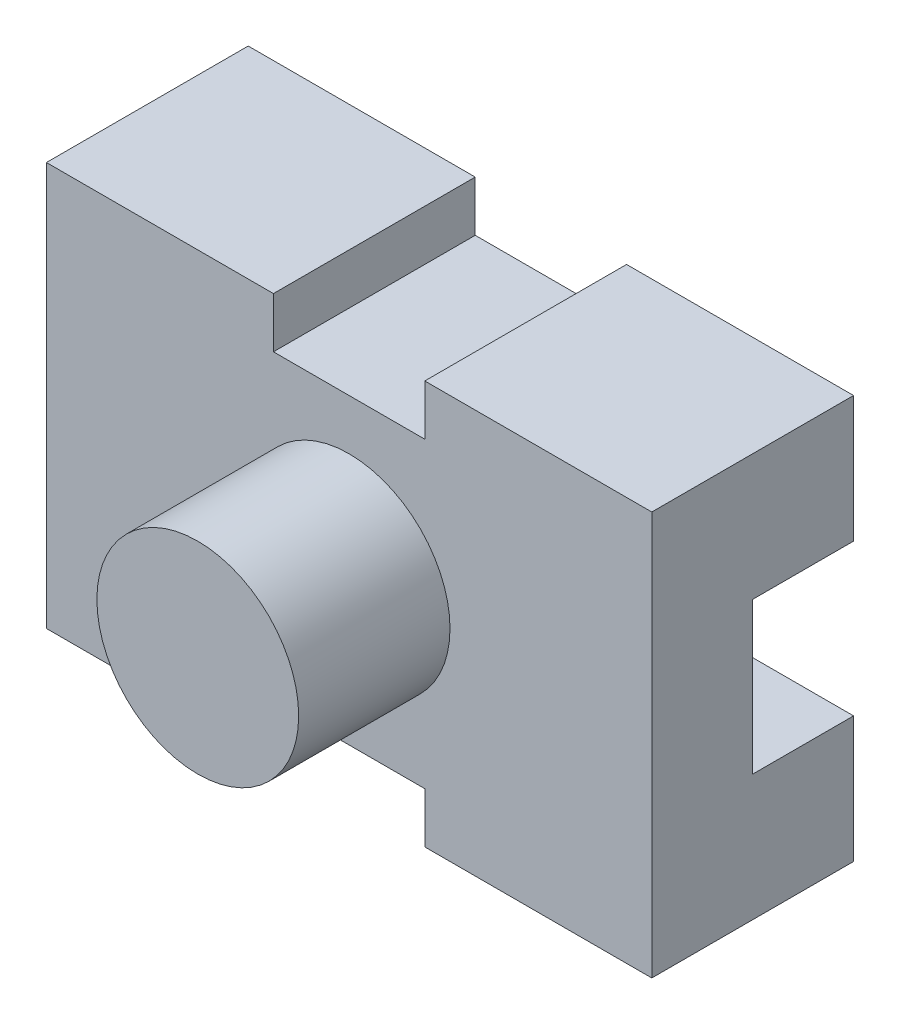
ISO-10303-21;
HEADER;
FILE_DESCRIPTION(('STEP AP214'),'2;1');
FILE_NAME('part.step','',(''),(''),'','','');
FILE_SCHEMA(('AUTOMOTIVE_DESIGN { 1 0 10303 214 1 1 1 1 }'));
ENDSEC;
DATA;
#1=APPLICATION_CONTEXT('core data for automotive mechanical design processes');
#2=APPLICATION_PROTOCOL_DEFINITION('international standard','automotive_design',2000,#1);
#3=PRODUCT_CONTEXT('',#1,'mechanical');
#4=PRODUCT('Part','Part','',(#3));
#5=PRODUCT_RELATED_PRODUCT_CATEGORY('part','',(#4));
#6=PRODUCT_DEFINITION_FORMATION('','',#4);
#7=PRODUCT_DEFINITION_CONTEXT('part definition',#1,'design');
#8=PRODUCT_DEFINITION('design','',#6,#7);
#9=PRODUCT_DEFINITION_SHAPE('','',#8);
#10=(LENGTH_UNIT() NAMED_UNIT(*) SI_UNIT(.MILLI.,.METRE.));
#11=(NAMED_UNIT(*) PLANE_ANGLE_UNIT() SI_UNIT($,.RADIAN.));
#12=(NAMED_UNIT(*) SI_UNIT($,.STERADIAN.) SOLID_ANGLE_UNIT());
#13=UNCERTAINTY_MEASURE_WITH_UNIT(LENGTH_MEASURE(1.E-05),#10,'distance_accuracy_value','');
#14=(GEOMETRIC_REPRESENTATION_CONTEXT(3) GLOBAL_UNCERTAINTY_ASSIGNED_CONTEXT((#13)) GLOBAL_UNIT_ASSIGNED_CONTEXT((#10,
#11,#12)) REPRESENTATION_CONTEXT('',''));
#15=CARTESIAN_POINT('',(0.,0.,0.));
#16=DIRECTION('',(0.,0.,1.));
#17=DIRECTION('',(1.,0.,0.));
#18=AXIS2_PLACEMENT_3D('',#15,#16,#17);
#19=CARTESIAN_POINT('',(0.,0.,0.));
#20=DIRECTION('',(0.,0.,-1.));
#21=DIRECTION('',(-1.,0.,0.));
#22=AXIS2_PLACEMENT_3D('',#19,#20,#21);
#23=PLANE('',#22);
#24=DIRECTION('',(-1.,0.,0.));
#25=VECTOR('',#24,1.);
#26=CARTESIAN_POINT('',(30.,7.5,0.));
#27=LINE('',#26,#25);
#28=CARTESIAN_POINT('',(30.,7.5,0.));
#29=VERTEX_POINT('',#28);
#30=CARTESIAN_POINT('',(-30.,7.5,0.));
#31=VERTEX_POINT('',#30);
#32=EDGE_CURVE('E231',#29,#31,#27,.T.);
#33=ORIENTED_EDGE('',*,*,#32,.T.);
#34=DIRECTION('',(0.,-1.,0.));
#35=VECTOR('',#34,1.);
#36=CARTESIAN_POINT('',(-30.,-20.,0.));
#37=LINE('',#36,#35);
#38=CARTESIAN_POINT('',(-30.,20.,0.));
#39=VERTEX_POINT('',#38);
#40=EDGE_CURVE('E181',#39,#31,#37,.T.);
#41=ORIENTED_EDGE('',*,*,#40,.F.);
#42=DIRECTION('',(-1.,0.,0.));
#43=VECTOR('',#42,1.);
#44=CARTESIAN_POINT('',(-30.,20.,0.));
#45=LINE('',#44,#43);
#46=CARTESIAN_POINT('',(-7.49999999999999,20.,0.));
#47=VERTEX_POINT('',#46);
#48=EDGE_CURVE('E170',#47,#39,#45,.T.);
#49=ORIENTED_EDGE('',*,*,#48,.F.);
#50=DIRECTION('',(0.,1.,0.));
#51=VECTOR('',#50,1.);
#52=CARTESIAN_POINT('',(-7.49999999999999,15.,0.));
#53=LINE('',#52,#51);
#54=CARTESIAN_POINT('',(-7.49999999999999,15.,0.));
#55=VERTEX_POINT('',#54);
#56=EDGE_CURVE('E217',#55,#47,#53,.T.);
#57=ORIENTED_EDGE('',*,*,#56,.F.);
#58=DIRECTION('',(-1.,0.,0.));
#59=VECTOR('',#58,1.);
#60=CARTESIAN_POINT('',(-7.49999999999999,15.,0.));
#61=LINE('',#60,#59);
#62=CARTESIAN_POINT('',(7.50000000000001,15.,0.));
#63=VERTEX_POINT('',#62);
#64=EDGE_CURVE('E213',#63,#55,#61,.T.);
#65=ORIENTED_EDGE('',*,*,#64,.F.);
#66=DIRECTION('',(0.,-1.,0.));
#67=VECTOR('',#66,1.);
#68=CARTESIAN_POINT('',(7.50000000000001,15.,0.));
#69=LINE('',#68,#67);
#70=CARTESIAN_POINT('',(7.50000000000001,20.,0.));
#71=VERTEX_POINT('',#70);
#72=EDGE_CURVE('E211',#71,#63,#69,.T.);
#73=ORIENTED_EDGE('',*,*,#72,.F.);
#74=CARTESIAN_POINT('',(30.,20.,0.));
#75=VERTEX_POINT('',#74);
#76=EDGE_CURVE('E173',#75,#71,#45,.T.);
#77=ORIENTED_EDGE('',*,*,#76,.F.);
#78=DIRECTION('',(0.,1.,0.));
#79=VECTOR('',#78,1.);
#80=CARTESIAN_POINT('',(30.,-20.,0.));
#81=LINE('',#80,#79);
#82=EDGE_CURVE('E171',#29,#75,#81,.T.);
#83=ORIENTED_EDGE('',*,*,#82,.F.);
#84=EDGE_LOOP('',(#33,#41,#49,#57,#65,#73,#77,#83));
#85=FACE_BOUND('',#84,.T.);
#86=ADVANCED_FACE('F34',(#85),#23,.T.);
#87=CARTESIAN_POINT('',(-30.,20.,20.));
#88=DIRECTION('',(0.,-1.,0.));
#89=DIRECTION('',(0.,0.,-1.));
#90=AXIS2_PLACEMENT_3D('',#87,#88,#89);
#91=PLANE('',#90);
#92=DIRECTION('',(0.,0.,1.));
#93=VECTOR('',#92,1.);
#94=CARTESIAN_POINT('',(7.50000000000001,20.,0.));
#95=LINE('',#94,#93);
#96=CARTESIAN_POINT('',(7.50000000000001,20.,20.));
#97=VERTEX_POINT('',#96);
#98=EDGE_CURVE('E227',#71,#97,#95,.T.);
#99=ORIENTED_EDGE('',*,*,#98,.T.);
#100=DIRECTION('',(-1.,0.,0.));
#101=VECTOR('',#100,1.);
#102=CARTESIAN_POINT('',(-30.,20.,20.));
#103=LINE('',#102,#101);
#104=CARTESIAN_POINT('',(30.,20.,20.));
#105=VERTEX_POINT('',#104);
#106=EDGE_CURVE('E202',#105,#97,#103,.T.);
#107=ORIENTED_EDGE('',*,*,#106,.F.);
#108=DIRECTION('',(0.,0.,-1.));
#109=VECTOR('',#108,1.);
#110=CARTESIAN_POINT('',(30.,20.,20.));
#111=LINE('',#110,#109);
#112=EDGE_CURVE('E42',#105,#75,#111,.T.);
#113=ORIENTED_EDGE('',*,*,#112,.T.);
#114=ORIENTED_EDGE('',*,*,#76,.T.);
#115=EDGE_LOOP('',(#99,#107,#113,#114));
#116=FACE_BOUND('',#115,.T.);
#117=ADVANCED_FACE('F199',(#116),#91,.F.);
#118=DIRECTION('',(0.,0.,1.));
#119=VECTOR('',#118,1.);
#120=CARTESIAN_POINT('',(-7.49999999999999,20.,0.));
#121=LINE('',#120,#119);
#122=CARTESIAN_POINT('',(-7.49999999999999,20.,20.));
#123=VERTEX_POINT('',#122);
#124=EDGE_CURVE('E238',#47,#123,#121,.T.);
#125=ORIENTED_EDGE('',*,*,#124,.F.);
#126=ORIENTED_EDGE('',*,*,#48,.T.);
#127=DIRECTION('',(0.,0.,-1.));
#128=VECTOR('',#127,1.);
#129=CARTESIAN_POINT('',(-30.,20.,20.));
#130=LINE('',#129,#128);
#131=CARTESIAN_POINT('',(-30.,20.,20.));
#132=VERTEX_POINT('',#131);
#133=EDGE_CURVE('E193',#132,#39,#130,.T.);
#134=ORIENTED_EDGE('',*,*,#133,.F.);
#135=EDGE_CURVE('E269',#123,#132,#103,.T.);
#136=ORIENTED_EDGE('',*,*,#135,.F.);
#137=EDGE_LOOP('',(#125,#126,#134,#136));
#138=FACE_BOUND('',#137,.T.);
#139=ADVANCED_FACE('F312',(#138),#91,.F.);
#140=CARTESIAN_POINT('',(0.,0.,20.));
#141=DIRECTION('',(0.,0.,-1.));
#142=DIRECTION('',(-1.,0.,0.));
#143=AXIS2_PLACEMENT_3D('',#140,#141,#142);
#144=PLANE('',#143);
#145=CARTESIAN_POINT('',(0.,0.,20.));
#146=DIRECTION('',(0.,0.,-1.));
#147=DIRECTION('',(-1.,0.,0.));
#148=AXIS2_PLACEMENT_3D('',#145,#146,#147);
#149=CIRCLE('',#148,10.);
#150=CARTESIAN_POINT('',(-10.,0.,20.));
#151=VERTEX_POINT('',#150);
#152=EDGE_CURVE('E11',#151,#151,#149,.F.);
#153=ORIENTED_EDGE('',*,*,#152,.F.);
#154=EDGE_LOOP('',(#153));
#155=FACE_BOUND('',#154,.T.);
#156=DIRECTION('',(0.,-1.,0.));
#157=VECTOR('',#156,1.);
#158=CARTESIAN_POINT('',(7.50000000000001,15.,20.));
#159=LINE('',#158,#157);
#160=CARTESIAN_POINT('',(7.50000000000001,15.,20.));
#161=VERTEX_POINT('',#160);
#162=EDGE_CURVE('E228',#97,#161,#159,.T.);
#163=ORIENTED_EDGE('',*,*,#162,.T.);
#164=DIRECTION('',(-1.,0.,0.));
#165=VECTOR('',#164,1.);
#166=CARTESIAN_POINT('',(-7.49999999999999,15.,20.));
#167=LINE('',#166,#165);
#168=CARTESIAN_POINT('',(-7.49999999999999,15.,20.));
#169=VERTEX_POINT('',#168);
#170=EDGE_CURVE('E218',#161,#169,#167,.T.);
#171=ORIENTED_EDGE('',*,*,#170,.T.);
#172=DIRECTION('',(0.,1.,0.));
#173=VECTOR('',#172,1.);
#174=CARTESIAN_POINT('',(-7.49999999999999,15.,20.));
#175=LINE('',#174,#173);
#176=EDGE_CURVE('E222',#169,#123,#175,.T.);
#177=ORIENTED_EDGE('',*,*,#176,.T.);
#178=ORIENTED_EDGE('',*,*,#135,.T.);
#179=DIRECTION('',(0.,-1.,0.));
#180=VECTOR('',#179,1.);
#181=CARTESIAN_POINT('',(-30.,-20.,20.));
#182=LINE('',#181,#180);
#183=CARTESIAN_POINT('',(-30.,-20.,20.));
#184=VERTEX_POINT('',#183);
#185=EDGE_CURVE('E270',#132,#184,#182,.T.);
#186=ORIENTED_EDGE('',*,*,#185,.T.);
#187=DIRECTION('',(1.,0.,0.));
#188=VECTOR('',#187,1.);
#189=CARTESIAN_POINT('',(-30.,-20.,20.));
#190=LINE('',#189,#188);
#191=CARTESIAN_POINT('',(-7.49999999999999,-20.,20.));
#192=VERTEX_POINT('',#191);
#193=EDGE_CURVE('E177',#184,#192,#190,.T.);
#194=ORIENTED_EDGE('',*,*,#193,.T.);
#195=DIRECTION('',(0.,-1.,0.));
#196=VECTOR('',#195,1.);
#197=CARTESIAN_POINT('',(-7.49999999999999,-15.,20.));
#198=LINE('',#197,#196);
#199=CARTESIAN_POINT('',(-7.49999999999999,-15.,20.));
#200=VERTEX_POINT('',#199);
#201=EDGE_CURVE('E245',#200,#192,#198,.T.);
#202=ORIENTED_EDGE('',*,*,#201,.F.);
#203=DIRECTION('',(-1.,0.,0.));
#204=VECTOR('',#203,1.);
#205=CARTESIAN_POINT('',(-7.49999999999999,-15.,20.));
#206=LINE('',#205,#204);
#207=CARTESIAN_POINT('',(7.50000000000001,-15.,20.));
#208=VERTEX_POINT('',#207);
#209=EDGE_CURVE('E254',#208,#200,#206,.T.);
#210=ORIENTED_EDGE('',*,*,#209,.F.);
#211=DIRECTION('',(0.,1.,0.));
#212=VECTOR('',#211,1.);
#213=CARTESIAN_POINT('',(7.50000000000001,-15.,20.));
#214=LINE('',#213,#212);
#215=CARTESIAN_POINT('',(7.50000000000001,-20.,20.));
#216=VERTEX_POINT('',#215);
#217=EDGE_CURVE('E236',#216,#208,#214,.T.);
#218=ORIENTED_EDGE('',*,*,#217,.F.);
#219=CARTESIAN_POINT('',(30.,-20.,20.));
#220=VERTEX_POINT('',#219);
#221=EDGE_CURVE('E271',#216,#220,#190,.T.);
#222=ORIENTED_EDGE('',*,*,#221,.T.);
#223=DIRECTION('',(0.,1.,0.));
#224=VECTOR('',#223,1.);
#225=CARTESIAN_POINT('',(30.,-20.,20.));
#226=LINE('',#225,#224);
#227=EDGE_CURVE('E188',#220,#105,#226,.T.);
#228=ORIENTED_EDGE('',*,*,#227,.T.);
#229=ORIENTED_EDGE('',*,*,#106,.T.);
#230=EDGE_LOOP('',(#163,#171,#177,#178,#186,#194,#202,#210,#218,#222,#228,#229));
#231=FACE_BOUND('',#230,.T.);
#232=ADVANCED_FACE('F280',(#155,#231),#144,.F.);
#233=DIRECTION('',(-1.,0.,0.));
#234=VECTOR('',#233,1.);
#235=CARTESIAN_POINT('',(30.,-7.5,0.));
#236=LINE('',#235,#234);
#237=CARTESIAN_POINT('',(30.,-7.5,0.));
#238=VERTEX_POINT('',#237);
#239=CARTESIAN_POINT('',(-30.,-7.5,0.));
#240=VERTEX_POINT('',#239);
#241=EDGE_CURVE('E49',#238,#240,#236,.T.);
#242=ORIENTED_EDGE('',*,*,#241,.F.);
#243=CARTESIAN_POINT('',(30.,-20.,0.));
#244=VERTEX_POINT('',#243);
#245=EDGE_CURVE('E161',#244,#238,#81,.T.);
#246=ORIENTED_EDGE('',*,*,#245,.F.);
#247=DIRECTION('',(1.,0.,0.));
#248=VECTOR('',#247,1.);
#249=CARTESIAN_POINT('',(-30.,-20.,0.));
#250=LINE('',#249,#248);
#251=CARTESIAN_POINT('',(7.50000000000001,-20.,0.));
#252=VERTEX_POINT('',#251);
#253=EDGE_CURVE('E184',#252,#244,#250,.T.);
#254=ORIENTED_EDGE('',*,*,#253,.F.);
#255=DIRECTION('',(0.,1.,0.));
#256=VECTOR('',#255,1.);
#257=CARTESIAN_POINT('',(7.50000000000001,-15.,0.));
#258=LINE('',#257,#256);
#259=CARTESIAN_POINT('',(7.50000000000001,-15.,0.));
#260=VERTEX_POINT('',#259);
#261=EDGE_CURVE('E241',#252,#260,#258,.T.);
#262=ORIENTED_EDGE('',*,*,#261,.T.);
#263=DIRECTION('',(-1.,0.,0.));
#264=VECTOR('',#263,1.);
#265=CARTESIAN_POINT('',(-7.49999999999999,-15.,0.));
#266=LINE('',#265,#264);
#267=CARTESIAN_POINT('',(-7.49999999999999,-15.,0.));
#268=VERTEX_POINT('',#267);
#269=EDGE_CURVE('E244',#260,#268,#266,.T.);
#270=ORIENTED_EDGE('',*,*,#269,.T.);
#271=DIRECTION('',(0.,-1.,0.));
#272=VECTOR('',#271,1.);
#273=CARTESIAN_POINT('',(-7.49999999999999,-15.,0.));
#274=LINE('',#273,#272);
#275=CARTESIAN_POINT('',(-7.49999999999999,-20.,0.));
#276=VERTEX_POINT('',#275);
#277=EDGE_CURVE('E248',#268,#276,#274,.T.);
#278=ORIENTED_EDGE('',*,*,#277,.T.);
#279=CARTESIAN_POINT('',(-30.,-20.,0.));
#280=VERTEX_POINT('',#279);
#281=EDGE_CURVE('E185',#280,#276,#250,.T.);
#282=ORIENTED_EDGE('',*,*,#281,.F.);
#283=EDGE_CURVE('E163',#240,#280,#37,.T.);
#284=ORIENTED_EDGE('',*,*,#283,.F.);
#285=EDGE_LOOP('',(#242,#246,#254,#262,#270,#278,#282,#284));
#286=FACE_BOUND('',#285,.T.);
#287=ADVANCED_FACE('F159',(#286),#23,.T.);
#288=CARTESIAN_POINT('',(-30.,-20.,20.));
#289=DIRECTION('',(0.,1.,0.));
#290=DIRECTION('',(0.,0.,1.));
#291=AXIS2_PLACEMENT_3D('',#288,#289,#290);
#292=PLANE('',#291);
#293=ORIENTED_EDGE('',*,*,#221,.F.);
#294=DIRECTION('',(0.,0.,1.));
#295=VECTOR('',#294,1.);
#296=CARTESIAN_POINT('',(7.50000000000001,-20.,0.));
#297=LINE('',#296,#295);
#298=EDGE_CURVE('E258',#252,#216,#297,.T.);
#299=ORIENTED_EDGE('',*,*,#298,.F.);
#300=ORIENTED_EDGE('',*,*,#253,.T.);
#301=DIRECTION('',(0.,0.,-1.));
#302=VECTOR('',#301,1.);
#303=CARTESIAN_POINT('',(30.,-20.,20.));
#304=LINE('',#303,#302);
#305=EDGE_CURVE('E169',#220,#244,#304,.T.);
#306=ORIENTED_EDGE('',*,*,#305,.F.);
#307=EDGE_LOOP('',(#293,#299,#300,#306));
#308=FACE_BOUND('',#307,.T.);
#309=ADVANCED_FACE('F293',(#308),#292,.F.);
#310=CARTESIAN_POINT('',(30.,-20.,20.));
#311=DIRECTION('',(-1.,0.,0.));
#312=DIRECTION('',(0.,0.,1.));
#313=AXIS2_PLACEMENT_3D('',#310,#311,#312);
#314=PLANE('',#313);
#315=DIRECTION('',(0.,1.,0.));
#316=VECTOR('',#315,1.);
#317=CARTESIAN_POINT('',(30.,-7.5,10.));
#318=LINE('',#317,#316);
#319=CARTESIAN_POINT('',(30.,-7.5,10.));
#320=VERTEX_POINT('',#319);
#321=CARTESIAN_POINT('',(30.,7.5,10.));
#322=VERTEX_POINT('',#321);
#323=EDGE_CURVE('E153',#320,#322,#318,.T.);
#324=ORIENTED_EDGE('',*,*,#323,.T.);
#325=DIRECTION('',(0.,0.,-1.));
#326=VECTOR('',#325,1.);
#327=CARTESIAN_POINT('',(30.,7.5,10.));
#328=LINE('',#327,#326);
#329=EDGE_CURVE('E164',#322,#29,#328,.T.);
#330=ORIENTED_EDGE('',*,*,#329,.T.);
#331=ORIENTED_EDGE('',*,*,#82,.T.);
#332=ORIENTED_EDGE('',*,*,#112,.F.);
#333=ORIENTED_EDGE('',*,*,#227,.F.);
#334=ORIENTED_EDGE('',*,*,#305,.T.);
#335=ORIENTED_EDGE('',*,*,#245,.T.);
#336=DIRECTION('',(0.,0.,1.));
#337=VECTOR('',#336,1.);
#338=CARTESIAN_POINT('',(30.,-7.5,10.));
#339=LINE('',#338,#337);
#340=EDGE_CURVE('E146',#238,#320,#339,.T.);
#341=ORIENTED_EDGE('',*,*,#340,.T.);
#342=EDGE_LOOP('',(#324,#330,#331,#332,#333,#334,#335,#341));
#343=FACE_BOUND('',#342,.T.);
#344=ADVANCED_FACE('F36',(#343),#314,.F.);
#345=CARTESIAN_POINT('',(-30.,-20.,20.));
#346=DIRECTION('',(1.,0.,0.));
#347=DIRECTION('',(0.,0.,-1.));
#348=AXIS2_PLACEMENT_3D('',#345,#346,#347);
#349=PLANE('',#348);
#350=ORIENTED_EDGE('',*,*,#40,.T.);
#351=DIRECTION('',(0.,0.,-1.));
#352=VECTOR('',#351,1.);
#353=CARTESIAN_POINT('',(-30.,7.5,10.));
#354=LINE('',#353,#352);
#355=CARTESIAN_POINT('',(-30.,7.5,10.));
#356=VERTEX_POINT('',#355);
#357=EDGE_CURVE('E154',#356,#31,#354,.T.);
#358=ORIENTED_EDGE('',*,*,#357,.F.);
#359=DIRECTION('',(0.,1.,0.));
#360=VECTOR('',#359,1.);
#361=CARTESIAN_POINT('',(-30.,-7.5,10.));
#362=LINE('',#361,#360);
#363=CARTESIAN_POINT('',(-30.,-7.5,10.));
#364=VERTEX_POINT('',#363);
#365=EDGE_CURVE('E357',#364,#356,#362,.T.);
#366=ORIENTED_EDGE('',*,*,#365,.F.);
#367=DIRECTION('',(0.,0.,1.));
#368=VECTOR('',#367,1.);
#369=CARTESIAN_POINT('',(-30.,-7.5,10.));
#370=LINE('',#369,#368);
#371=EDGE_CURVE('E358',#240,#364,#370,.T.);
#372=ORIENTED_EDGE('',*,*,#371,.F.);
#373=ORIENTED_EDGE('',*,*,#283,.T.);
#374=DIRECTION('',(0.,0.,-1.));
#375=VECTOR('',#374,1.);
#376=CARTESIAN_POINT('',(-30.,-20.,20.));
#377=LINE('',#376,#375);
#378=EDGE_CURVE('E190',#184,#280,#377,.T.);
#379=ORIENTED_EDGE('',*,*,#378,.F.);
#380=ORIENTED_EDGE('',*,*,#185,.F.);
#381=ORIENTED_EDGE('',*,*,#133,.T.);
#382=EDGE_LOOP('',(#350,#358,#366,#372,#373,#379,#380,#381));
#383=FACE_BOUND('',#382,.T.);
#384=ADVANCED_FACE('F332',(#383),#349,.F.);
#385=ORIENTED_EDGE('',*,*,#281,.T.);
#386=DIRECTION('',(0.,0.,1.));
#387=VECTOR('',#386,1.);
#388=CARTESIAN_POINT('',(-7.49999999999999,-20.,0.));
#389=LINE('',#388,#387);
#390=EDGE_CURVE('E260',#276,#192,#389,.T.);
#391=ORIENTED_EDGE('',*,*,#390,.T.);
#392=ORIENTED_EDGE('',*,*,#193,.F.);
#393=ORIENTED_EDGE('',*,*,#378,.T.);
#394=EDGE_LOOP('',(#385,#391,#392,#393));
#395=FACE_BOUND('',#394,.T.);
#396=ADVANCED_FACE('F283',(#395),#292,.F.);
#397=CARTESIAN_POINT('',(0.,0.,35.));
#398=DIRECTION('',(0.,0.,-1.));
#399=DIRECTION('',(-1.,0.,0.));
#400=AXIS2_PLACEMENT_3D('',#397,#398,#399);
#401=CYLINDRICAL_SURFACE('',#400,10.);
#402=CARTESIAN_POINT('',(0.,0.,35.));
#403=DIRECTION('',(0.,0.,1.));
#404=DIRECTION('',(1.,0.,0.));
#405=AXIS2_PLACEMENT_3D('',#402,#403,#404);
#406=CIRCLE('',#405,10.);
#407=CARTESIAN_POINT('',(10.,0.,35.));
#408=VERTEX_POINT('',#407);
#409=EDGE_CURVE('E175',#408,#408,#406,.T.);
#410=ORIENTED_EDGE('',*,*,#409,.F.);
#411=EDGE_LOOP('',(#410));
#412=FACE_BOUND('',#411,.T.);
#413=ORIENTED_EDGE('',*,*,#152,.T.);
#414=EDGE_LOOP('',(#413));
#415=FACE_BOUND('',#414,.T.);
#416=ADVANCED_FACE('F303',(#412,#415),#401,.T.);
#417=CARTESIAN_POINT('',(0.,0.,35.));
#418=DIRECTION('',(0.,0.,1.));
#419=DIRECTION('',(1.,0.,0.));
#420=AXIS2_PLACEMENT_3D('',#417,#418,#419);
#421=PLANE('',#420);
#422=ORIENTED_EDGE('',*,*,#409,.T.);
#423=EDGE_LOOP('',(#422));
#424=FACE_BOUND('',#423,.T.);
#425=ADVANCED_FACE('F296',(#424),#421,.T.);
#426=CARTESIAN_POINT('',(7.50000000000001,-15.,0.));
#427=DIRECTION('',(1.,0.,0.));
#428=DIRECTION('',(0.,0.,-1.));
#429=AXIS2_PLACEMENT_3D('',#426,#427,#428);
#430=PLANE('',#429);
#431=ORIENTED_EDGE('',*,*,#217,.T.);
#432=DIRECTION('',(0.,0.,1.));
#433=VECTOR('',#432,1.);
#434=CARTESIAN_POINT('',(7.50000000000001,-15.,0.));
#435=LINE('',#434,#433);
#436=EDGE_CURVE('E251',#260,#208,#435,.T.);
#437=ORIENTED_EDGE('',*,*,#436,.F.);
#438=ORIENTED_EDGE('',*,*,#261,.F.);
#439=ORIENTED_EDGE('',*,*,#298,.T.);
#440=EDGE_LOOP('',(#431,#437,#438,#439));
#441=FACE_BOUND('',#440,.T.);
#442=ADVANCED_FACE('F294',(#441),#430,.F.);
#443=CARTESIAN_POINT('',(-7.49999999999999,-15.,0.));
#444=DIRECTION('',(-1.,0.,0.));
#445=DIRECTION('',(0.,-1.,0.));
#446=AXIS2_PLACEMENT_3D('',#443,#444,#445);
#447=PLANE('',#446);
#448=ORIENTED_EDGE('',*,*,#201,.T.);
#449=ORIENTED_EDGE('',*,*,#390,.F.);
#450=ORIENTED_EDGE('',*,*,#277,.F.);
#451=DIRECTION('',(0.,0.,1.));
#452=VECTOR('',#451,1.);
#453=CARTESIAN_POINT('',(-7.49999999999999,-15.,0.));
#454=LINE('',#453,#452);
#455=EDGE_CURVE('E263',#268,#200,#454,.T.);
#456=ORIENTED_EDGE('',*,*,#455,.T.);
#457=EDGE_LOOP('',(#448,#449,#450,#456));
#458=FACE_BOUND('',#457,.T.);
#459=ADVANCED_FACE('F285',(#458),#447,.F.);
#460=CARTESIAN_POINT('',(-7.49999999999999,-15.,0.));
#461=DIRECTION('',(0.,1.,0.));
#462=DIRECTION('',(0.,0.,1.));
#463=AXIS2_PLACEMENT_3D('',#460,#461,#462);
#464=PLANE('',#463);
#465=ORIENTED_EDGE('',*,*,#209,.T.);
#466=ORIENTED_EDGE('',*,*,#455,.F.);
#467=ORIENTED_EDGE('',*,*,#269,.F.);
#468=ORIENTED_EDGE('',*,*,#436,.T.);
#469=EDGE_LOOP('',(#465,#466,#467,#468));
#470=FACE_BOUND('',#469,.T.);
#471=ADVANCED_FACE('F289',(#470),#464,.F.);
#472=CARTESIAN_POINT('',(7.50000000000001,15.,0.));
#473=DIRECTION('',(-1.,0.,0.));
#474=DIRECTION('',(0.,0.,1.));
#475=AXIS2_PLACEMENT_3D('',#472,#473,#474);
#476=PLANE('',#475);
#477=ORIENTED_EDGE('',*,*,#162,.F.);
#478=ORIENTED_EDGE('',*,*,#98,.F.);
#479=ORIENTED_EDGE('',*,*,#72,.T.);
#480=DIRECTION('',(0.,0.,1.));
#481=VECTOR('',#480,1.);
#482=CARTESIAN_POINT('',(7.50000000000001,15.,0.));
#483=LINE('',#482,#481);
#484=EDGE_CURVE('E234',#63,#161,#483,.T.);
#485=ORIENTED_EDGE('',*,*,#484,.T.);
#486=EDGE_LOOP('',(#477,#478,#479,#485));
#487=FACE_BOUND('',#486,.T.);
#488=ADVANCED_FACE('F377',(#487),#476,.T.);
#489=CARTESIAN_POINT('',(-7.49999999999999,15.,0.));
#490=DIRECTION('',(0.,1.,0.));
#491=DIRECTION('',(0.,0.,1.));
#492=AXIS2_PLACEMENT_3D('',#489,#490,#491);
#493=PLANE('',#492);
#494=ORIENTED_EDGE('',*,*,#170,.F.);
#495=ORIENTED_EDGE('',*,*,#484,.F.);
#496=ORIENTED_EDGE('',*,*,#64,.T.);
#497=DIRECTION('',(0.,0.,1.));
#498=VECTOR('',#497,1.);
#499=CARTESIAN_POINT('',(-7.49999999999999,15.,0.));
#500=LINE('',#499,#498);
#501=EDGE_CURVE('E57',#55,#169,#500,.T.);
#502=ORIENTED_EDGE('',*,*,#501,.T.);
#503=EDGE_LOOP('',(#494,#495,#496,#502));
#504=FACE_BOUND('',#503,.T.);
#505=ADVANCED_FACE('F371',(#504),#493,.T.);
#506=CARTESIAN_POINT('',(-7.49999999999999,15.,0.));
#507=DIRECTION('',(1.,0.,0.));
#508=DIRECTION('',(0.,1.,0.));
#509=AXIS2_PLACEMENT_3D('',#506,#507,#508);
#510=PLANE('',#509);
#511=ORIENTED_EDGE('',*,*,#176,.F.);
#512=ORIENTED_EDGE('',*,*,#501,.F.);
#513=ORIENTED_EDGE('',*,*,#56,.T.);
#514=ORIENTED_EDGE('',*,*,#124,.T.);
#515=EDGE_LOOP('',(#511,#512,#513,#514));
#516=FACE_BOUND('',#515,.T.);
#517=ADVANCED_FACE('F364',(#516),#510,.T.);
#518=CARTESIAN_POINT('',(30.,7.5,10.));
#519=DIRECTION('',(0.,1.,0.));
#520=DIRECTION('',(0.,0.,1.));
#521=AXIS2_PLACEMENT_3D('',#518,#519,#520);
#522=PLANE('',#521);
#523=ORIENTED_EDGE('',*,*,#357,.T.);
#524=ORIENTED_EDGE('',*,*,#32,.F.);
#525=ORIENTED_EDGE('',*,*,#329,.F.);
#526=DIRECTION('',(-1.,0.,0.));
#527=VECTOR('',#526,1.);
#528=CARTESIAN_POINT('',(30.,7.5,10.));
#529=LINE('',#528,#527);
#530=EDGE_CURVE('E349',#322,#356,#529,.T.);
#531=ORIENTED_EDGE('',*,*,#530,.T.);
#532=EDGE_LOOP('',(#523,#524,#525,#531));
#533=FACE_BOUND('',#532,.T.);
#534=ADVANCED_FACE('F362',(#533),#522,.F.);
#535=CARTESIAN_POINT('',(30.,-7.5,10.));
#536=DIRECTION('',(0.,0.,1.));
#537=DIRECTION('',(1.,0.,0.));
#538=AXIS2_PLACEMENT_3D('',#535,#536,#537);
#539=PLANE('',#538);
#540=ORIENTED_EDGE('',*,*,#365,.T.);
#541=ORIENTED_EDGE('',*,*,#530,.F.);
#542=ORIENTED_EDGE('',*,*,#323,.F.);
#543=DIRECTION('',(-1.,0.,0.));
#544=VECTOR('',#543,1.);
#545=CARTESIAN_POINT('',(30.,-7.5,10.));
#546=LINE('',#545,#544);
#547=EDGE_CURVE('E148',#320,#364,#546,.T.);
#548=ORIENTED_EDGE('',*,*,#547,.T.);
#549=EDGE_LOOP('',(#540,#541,#542,#548));
#550=FACE_BOUND('',#549,.T.);
#551=ADVANCED_FACE('F356',(#550),#539,.F.);
#552=CARTESIAN_POINT('',(30.,-7.5,10.));
#553=DIRECTION('',(0.,-1.,0.));
#554=DIRECTION('',(0.,0.,-1.));
#555=AXIS2_PLACEMENT_3D('',#552,#553,#554);
#556=PLANE('',#555);
#557=ORIENTED_EDGE('',*,*,#371,.T.);
#558=ORIENTED_EDGE('',*,*,#547,.F.);
#559=ORIENTED_EDGE('',*,*,#340,.F.);
#560=ORIENTED_EDGE('',*,*,#241,.T.);
#561=EDGE_LOOP('',(#557,#558,#559,#560));
#562=FACE_BOUND('',#561,.T.);
#563=ADVANCED_FACE('F147',(#562),#556,.F.);
#564=CLOSED_SHELL('',(#86,#117,#139,#232,#287,#309,#344,#384,#396,#416,#425,#442,#459,#471,#488,
#505,#517,#534,#551,#563));
#565=MANIFOLD_SOLID_BREP('B2',#564);
#566=ADVANCED_BREP_SHAPE_REPRESENTATION('',(#18,#565),#14);
#567=SHAPE_DEFINITION_REPRESENTATION(#9,#566);
ENDSEC;
END-ISO-10303-21;
